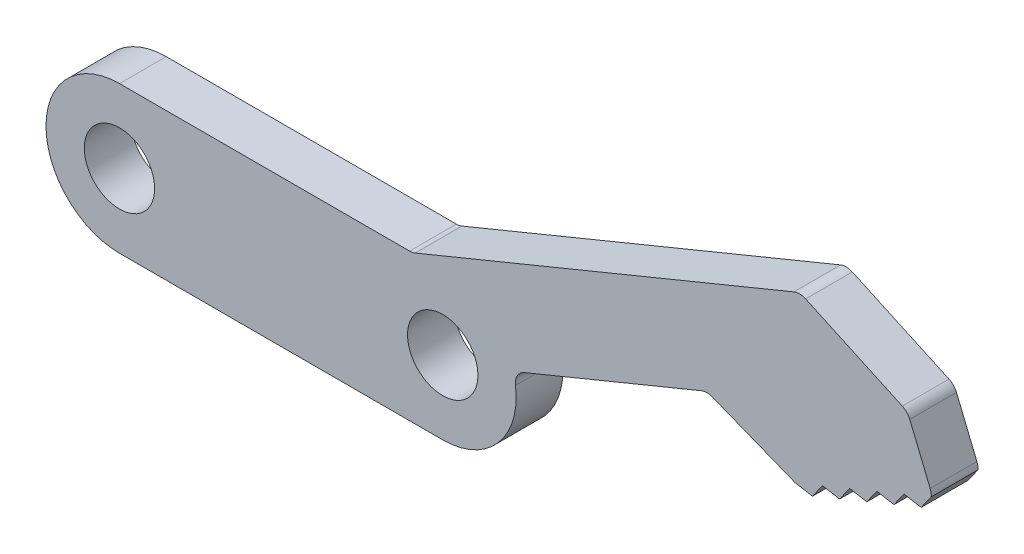
ISO-10303-21;
HEADER;
FILE_DESCRIPTION(('STEP AP214'),'2;1');
FILE_NAME('part.step','',(''),(''),'','','');
FILE_SCHEMA(('AUTOMOTIVE_DESIGN { 1 0 10303 214 1 1 1 1 }'));
ENDSEC;
DATA;
#1=APPLICATION_CONTEXT('core data for automotive mechanical design processes');
#2=APPLICATION_PROTOCOL_DEFINITION('international standard','automotive_design',2000,#1);
#3=PRODUCT_CONTEXT('',#1,'mechanical');
#4=PRODUCT('Part','Part','',(#3));
#5=PRODUCT_RELATED_PRODUCT_CATEGORY('part','',(#4));
#6=PRODUCT_DEFINITION_FORMATION('','',#4);
#7=PRODUCT_DEFINITION_CONTEXT('part definition',#1,'design');
#8=PRODUCT_DEFINITION('design','',#6,#7);
#9=PRODUCT_DEFINITION_SHAPE('','',#8);
#10=(LENGTH_UNIT() NAMED_UNIT(*) SI_UNIT(.MILLI.,.METRE.));
#11=(NAMED_UNIT(*) PLANE_ANGLE_UNIT() SI_UNIT($,.RADIAN.));
#12=(NAMED_UNIT(*) SI_UNIT($,.STERADIAN.) SOLID_ANGLE_UNIT());
#13=UNCERTAINTY_MEASURE_WITH_UNIT(LENGTH_MEASURE(1.E-05),#10,'distance_accuracy_value','');
#14=(GEOMETRIC_REPRESENTATION_CONTEXT(3) GLOBAL_UNCERTAINTY_ASSIGNED_CONTEXT((#13)) GLOBAL_UNIT_ASSIGNED_CONTEXT((#10,
#11,#12)) REPRESENTATION_CONTEXT('',''));
#15=CARTESIAN_POINT('',(0.,0.,0.));
#16=DIRECTION('',(0.,0.,1.));
#17=DIRECTION('',(1.,0.,0.));
#18=AXIS2_PLACEMENT_3D('',#15,#16,#17);
#19=CARTESIAN_POINT('',(22.,0.,3.18));
#20=DIRECTION('',(0.,0.,-1.));
#21=DIRECTION('',(-1.,0.,0.));
#22=AXIS2_PLACEMENT_3D('',#19,#20,#21);
#23=CYLINDRICAL_SURFACE('',#22,5.);
#24=CARTESIAN_POINT('',(22.,0.,0.));
#25=DIRECTION('',(0.,0.,1.));
#26=DIRECTION('',(1.,0.,0.));
#27=AXIS2_PLACEMENT_3D('',#24,#25,#26);
#28=CIRCLE('',#27,5.);
#29=CARTESIAN_POINT('',(22.,-5.,0.));
#30=VERTEX_POINT('',#29);
#31=CARTESIAN_POINT('',(26.9528767346151,0.68484454565145,0.));
#32=VERTEX_POINT('',#31);
#33=EDGE_CURVE('E303',#30,#32,#28,.T.);
#34=ORIENTED_EDGE('',*,*,#33,.T.);
#35=DIRECTION('',(0.,0.,-1.));
#36=VECTOR('',#35,1.);
#37=CARTESIAN_POINT('',(26.9528767346151,0.684844545651449,3.18));
#38=LINE('',#37,#36);
#39=CARTESIAN_POINT('',(26.9528767346151,0.68484454565145,3.18));
#40=VERTEX_POINT('',#39);
#41=EDGE_CURVE('E432',#32,#40,#38,.F.);
#42=ORIENTED_EDGE('',*,*,#41,.T.);
#43=CARTESIAN_POINT('',(22.,0.,3.18));
#44=DIRECTION('',(0.,0.,1.));
#45=DIRECTION('',(1.,0.,0.));
#46=AXIS2_PLACEMENT_3D('',#43,#44,#45);
#47=CIRCLE('',#46,5.);
#48=CARTESIAN_POINT('',(22.,-5.,3.18));
#49=VERTEX_POINT('',#48);
#50=EDGE_CURVE('E374',#49,#40,#47,.T.);
#51=ORIENTED_EDGE('',*,*,#50,.F.);
#52=DIRECTION('',(0.,0.,-1.));
#53=VECTOR('',#52,1.);
#54=CARTESIAN_POINT('',(22.,-5.,3.18));
#55=LINE('',#54,#53);
#56=EDGE_CURVE('E302',#49,#30,#55,.T.);
#57=ORIENTED_EDGE('',*,*,#56,.T.);
#58=EDGE_LOOP('',(#34,#42,#51,#57));
#59=FACE_BOUND('',#58,.T.);
#60=ADVANCED_FACE('F45',(#59),#23,.T.);
#61=CARTESIAN_POINT('',(3.37133749376371,-8.19978084499884,3.18));
#62=DIRECTION('',(-0.380263412733207,0.924878228166549,0.));
#63=DIRECTION('',(-0.924878228166549,-0.380263412733207,0.));
#64=AXIS2_PLACEMENT_3D('',#61,#62,#63);
#65=PLANE('',#64);
#66=DIRECTION('',(0.924878228166549,0.380263412733207,0.));
#67=VECTOR('',#66,1.);
#68=CARTESIAN_POINT('',(3.37133749376371,-8.19978084499884,0.));
#69=LINE('',#68,#67);
#70=CARTESIAN_POINT('',(27.5631886688049,1.74669168294829,0.));
#71=VERTEX_POINT('',#70);
#72=CARTESIAN_POINT('',(39.6051039173005,6.69772161184437,0.));
#73=VERTEX_POINT('',#72);
#74=EDGE_CURVE('E307',#71,#73,#69,.T.);
#75=ORIENTED_EDGE('',*,*,#74,.T.);
#76=DIRECTION('',(0.,0.,-1.));
#77=VECTOR('',#76,1.);
#78=CARTESIAN_POINT('',(39.6051039173005,6.69772161184437,3.18));
#79=LINE('',#78,#77);
#80=CARTESIAN_POINT('',(39.6051039173005,6.69772161184437,3.18));
#81=VERTEX_POINT('',#80);
#82=EDGE_CURVE('E429',#73,#81,#79,.F.);
#83=ORIENTED_EDGE('',*,*,#82,.T.);
#84=DIRECTION('',(0.924878228166549,0.380263412733207,0.));
#85=VECTOR('',#84,1.);
#86=CARTESIAN_POINT('',(3.37133749376371,-8.19978084499884,3.18));
#87=LINE('',#86,#85);
#88=CARTESIAN_POINT('',(27.5631886688049,1.74669168294829,3.18));
#89=VERTEX_POINT('',#88);
#90=EDGE_CURVE('E226',#89,#81,#87,.T.);
#91=ORIENTED_EDGE('',*,*,#90,.F.);
#92=DIRECTION('',(0.,0.,1.));
#93=VECTOR('',#92,1.);
#94=CARTESIAN_POINT('',(27.5631886688049,1.74669168294829,0.));
#95=LINE('',#94,#93);
#96=EDGE_CURVE('E425',#89,#71,#95,.F.);
#97=ORIENTED_EDGE('',*,*,#96,.T.);
#98=EDGE_LOOP('',(#75,#83,#91,#97));
#99=FACE_BOUND('',#98,.T.);
#100=ADVANCED_FACE('F597',(#99),#65,.F.);
#101=CARTESIAN_POINT('',(7.79104990716966,19.6278850306313,3.18));
#102=DIRECTION('',(0.368935795459582,0.929454882621317,0.));
#103=DIRECTION('',(-0.929454882621317,0.368935795459582,0.));
#104=AXIS2_PLACEMENT_3D('',#101,#102,#103);
#105=PLANE('',#104);
#106=DIRECTION('',(0.929454882621317,-0.368935795459582,0.));
#107=VECTOR('',#106,1.);
#108=CARTESIAN_POINT('',(7.79104990716966,19.6278850306313,3.18));
#109=LINE('',#108,#107);
#110=CARTESIAN_POINT('',(40.3543031254933,6.70229826629914,3.18));
#111=VERTEX_POINT('',#110);
#112=CARTESIAN_POINT('',(45.9997918227243,4.46139028656279,3.18));
#113=VERTEX_POINT('',#112);
#114=EDGE_CURVE('E211',#111,#113,#109,.T.);
#115=ORIENTED_EDGE('',*,*,#114,.F.);
#116=DIRECTION('',(0.,0.,-1.));
#117=VECTOR('',#116,1.);
#118=CARTESIAN_POINT('',(40.3543031254932,6.70229826629914,0.));
#119=LINE('',#118,#117);
#120=CARTESIAN_POINT('',(40.3543031254933,6.70229826629914,0.));
#121=VERTEX_POINT('',#120);
#122=EDGE_CURVE('E236',#111,#121,#119,.T.);
#123=ORIENTED_EDGE('',*,*,#122,.T.);
#124=DIRECTION('',(0.929454882621317,-0.368935795459582,0.));
#125=VECTOR('',#124,1.);
#126=CARTESIAN_POINT('',(7.79104990716966,19.6278850306313,0.));
#127=LINE('',#126,#125);
#128=CARTESIAN_POINT('',(45.9997918227243,4.46139028656279,0.));
#129=VERTEX_POINT('',#128);
#130=EDGE_CURVE('E232',#121,#129,#127,.T.);
#131=ORIENTED_EDGE('',*,*,#130,.T.);
#132=DIRECTION('',(0.,0.,-1.));
#133=VECTOR('',#132,1.);
#134=CARTESIAN_POINT('',(45.9997918227243,4.46139028656279,3.18));
#135=LINE('',#134,#133);
#136=EDGE_CURVE('E229',#113,#129,#135,.T.);
#137=ORIENTED_EDGE('',*,*,#136,.F.);
#138=EDGE_LOOP('',(#115,#123,#131,#137));
#139=FACE_BOUND('',#138,.T.);
#140=ADVANCED_FACE('F230',(#139),#105,.F.);
#141=CARTESIAN_POINT('',(2.10188818596754,12.0919570232387,3.18));
#142=DIRECTION('',(0.17125727503037,0.985226342395072,0.));
#143=DIRECTION('',(-0.985226342395072,0.17125727503037,0.));
#144=AXIS2_PLACEMENT_3D('',#141,#142,#143);
#145=PLANE('',#144);
#146=DIRECTION('',(0.985226342395072,-0.17125727503037,0.));
#147=VECTOR('',#146,1.);
#148=CARTESIAN_POINT('',(2.10188818596754,12.0919570232387,0.));
#149=LINE('',#148,#147);
#150=CARTESIAN_POINT('',(47.1642360009128,4.25898041555108,0.));
#151=VERTEX_POINT('',#150);
#152=EDGE_CURVE('E313',#129,#151,#149,.T.);
#153=ORIENTED_EDGE('',*,*,#152,.T.);
#154=DIRECTION('',(0.,0.,-1.));
#155=VECTOR('',#154,1.);
#156=CARTESIAN_POINT('',(47.1642360009128,4.25898041555108,3.18));
#157=LINE('',#156,#155);
#158=CARTESIAN_POINT('',(47.1642360009128,4.25898041555108,3.18));
#159=VERTEX_POINT('',#158);
#160=EDGE_CURVE('E237',#159,#151,#157,.T.);
#161=ORIENTED_EDGE('',*,*,#160,.F.);
#162=DIRECTION('',(0.985226342395072,-0.17125727503037,0.));
#163=VECTOR('',#162,1.);
#164=CARTESIAN_POINT('',(2.10188818596754,12.0919570232387,3.18));
#165=LINE('',#164,#163);
#166=EDGE_CURVE('E217',#113,#159,#165,.T.);
#167=ORIENTED_EDGE('',*,*,#166,.F.);
#168=ORIENTED_EDGE('',*,*,#136,.T.);
#169=EDGE_LOOP('',(#153,#161,#167,#168));
#170=FACE_BOUND('',#169,.T.);
#171=ADVANCED_FACE('F239',(#170),#145,.F.);
#172=CARTESIAN_POINT('',(29.2951152139847,-20.8490363065743,3.18));
#173=DIRECTION('',(-0.814732571298571,0.579836905746106,0.));
#174=DIRECTION('',(-0.579836905746106,-0.814732571298571,0.));
#175=AXIS2_PLACEMENT_3D('',#172,#173,#174);
#176=PLANE('',#175);
#177=DIRECTION('',(0.579836905746106,0.814732571298571,0.));
#178=VECTOR('',#177,1.);
#179=CARTESIAN_POINT('',(29.2951152139847,-20.8490363065743,0.));
#180=LINE('',#179,#178);
#181=CARTESIAN_POINT('',(47.8495482790574,5.22191711202921,0.));
#182=VERTEX_POINT('',#181);
#183=EDGE_CURVE('E316',#151,#182,#180,.T.);
#184=ORIENTED_EDGE('',*,*,#183,.T.);
#185=DIRECTION('',(0.,0.,-1.));
#186=VECTOR('',#185,1.);
#187=CARTESIAN_POINT('',(47.8495482790574,5.22191711202921,3.18));
#188=LINE('',#187,#186);
#189=CARTESIAN_POINT('',(47.8495482790574,5.22191711202921,3.18));
#190=VERTEX_POINT('',#189);
#191=EDGE_CURVE('E417',#190,#182,#188,.T.);
#192=ORIENTED_EDGE('',*,*,#191,.F.);
#193=DIRECTION('',(0.579836905746106,0.814732571298571,0.));
#194=VECTOR('',#193,1.);
#195=CARTESIAN_POINT('',(29.2951152139847,-20.8490363065743,3.18));
#196=LINE('',#195,#194);
#197=EDGE_CURVE('E243',#159,#190,#196,.T.);
#198=ORIENTED_EDGE('',*,*,#197,.F.);
#199=ORIENTED_EDGE('',*,*,#160,.T.);
#200=EDGE_LOOP('',(#184,#192,#198,#199));
#201=FACE_BOUND('',#200,.T.);
#202=ADVANCED_FACE('F533',(#201),#176,.F.);
#203=CARTESIAN_POINT('',(2.28446133900246,13.142282504316,3.18));
#204=DIRECTION('',(0.17125727503036,0.985226342395074,0.));
#205=DIRECTION('',(-0.985226342395074,0.17125727503036,0.));
#206=AXIS2_PLACEMENT_3D('',#203,#204,#205);
#207=PLANE('',#206);
#208=DIRECTION('',(0.985226342395074,-0.17125727503036,0.));
#209=VECTOR('',#208,1.);
#210=CARTESIAN_POINT('',(2.28446133900246,13.142282504316,0.));
#211=LINE('',#210,#209);
#212=CARTESIAN_POINT('',(49.0139924572459,5.01950724101749,0.));
#213=VERTEX_POINT('',#212);
#214=EDGE_CURVE('E319',#182,#213,#211,.T.);
#215=ORIENTED_EDGE('',*,*,#214,.T.);
#216=DIRECTION('',(0.,0.,-1.));
#217=VECTOR('',#216,1.);
#218=CARTESIAN_POINT('',(49.0139924572459,5.01950724101749,3.18));
#219=LINE('',#218,#217);
#220=CARTESIAN_POINT('',(49.0139924572459,5.01950724101749,3.18));
#221=VERTEX_POINT('',#220);
#222=EDGE_CURVE('E413',#221,#213,#219,.T.);
#223=ORIENTED_EDGE('',*,*,#222,.F.);
#224=DIRECTION('',(0.985226342395074,-0.17125727503036,0.));
#225=VECTOR('',#224,1.);
#226=CARTESIAN_POINT('',(2.28446133900246,13.142282504316,3.18));
#227=LINE('',#226,#225);
#228=EDGE_CURVE('E246',#190,#221,#227,.T.);
#229=ORIENTED_EDGE('',*,*,#228,.F.);
#230=ORIENTED_EDGE('',*,*,#191,.T.);
#231=EDGE_LOOP('',(#215,#223,#229,#230));
#232=FACE_BOUND('',#231,.T.);
#233=ADVANCED_FACE('F540',(#232),#207,.F.);
#234=CARTESIAN_POINT('',(30.1636814947223,-21.4671861171995,3.18));
#235=DIRECTION('',(-0.81473257129857,0.579836905746107,0.));
#236=DIRECTION('',(-0.579836905746107,-0.81473257129857,0.));
#237=AXIS2_PLACEMENT_3D('',#234,#235,#236);
#238=PLANE('',#237);
#239=DIRECTION('',(0.579836905746107,0.81473257129857,0.));
#240=VECTOR('',#239,1.);
#241=CARTESIAN_POINT('',(30.1636814947223,-21.4671861171995,0.));
#242=LINE('',#241,#240);
#243=CARTESIAN_POINT('',(49.6993047353905,5.98244393749563,0.));
#244=VERTEX_POINT('',#243);
#245=EDGE_CURVE('E322',#213,#244,#242,.T.);
#246=ORIENTED_EDGE('',*,*,#245,.T.);
#247=DIRECTION('',(0.,0.,-1.));
#248=VECTOR('',#247,1.);
#249=CARTESIAN_POINT('',(49.6993047353905,5.98244393749563,3.18));
#250=LINE('',#249,#248);
#251=CARTESIAN_POINT('',(49.6993047353905,5.98244393749563,3.18));
#252=VERTEX_POINT('',#251);
#253=EDGE_CURVE('E409',#252,#244,#250,.T.);
#254=ORIENTED_EDGE('',*,*,#253,.F.);
#255=DIRECTION('',(0.579836905746107,0.81473257129857,0.));
#256=VECTOR('',#255,1.);
#257=CARTESIAN_POINT('',(30.1636814947223,-21.4671861171995,3.18));
#258=LINE('',#257,#256);
#259=EDGE_CURVE('E252',#221,#252,#258,.T.);
#260=ORIENTED_EDGE('',*,*,#259,.F.);
#261=ORIENTED_EDGE('',*,*,#222,.T.);
#262=EDGE_LOOP('',(#246,#254,#260,#261));
#263=FACE_BOUND('',#262,.T.);
#264=ADVANCED_FACE('F543',(#263),#238,.F.);
#265=CARTESIAN_POINT('',(2.46703449203757,14.1926079853937,3.18));
#266=DIRECTION('',(0.17125727503036,0.985226342395074,0.));
#267=DIRECTION('',(-0.985226342395074,0.17125727503036,0.));
#268=AXIS2_PLACEMENT_3D('',#265,#266,#267);
#269=PLANE('',#268);
#270=DIRECTION('',(0.985226342395074,-0.17125727503036,0.));
#271=VECTOR('',#270,1.);
#272=CARTESIAN_POINT('',(2.46703449203757,14.1926079853937,0.));
#273=LINE('',#272,#271);
#274=CARTESIAN_POINT('',(50.863748913579,5.78003406648391,0.));
#275=VERTEX_POINT('',#274);
#276=EDGE_CURVE('E325',#244,#275,#273,.T.);
#277=ORIENTED_EDGE('',*,*,#276,.T.);
#278=DIRECTION('',(0.,0.,-1.));
#279=VECTOR('',#278,1.);
#280=CARTESIAN_POINT('',(50.863748913579,5.78003406648391,3.18));
#281=LINE('',#280,#279);
#282=CARTESIAN_POINT('',(50.863748913579,5.78003406648391,3.18));
#283=VERTEX_POINT('',#282);
#284=EDGE_CURVE('E405',#283,#275,#281,.T.);
#285=ORIENTED_EDGE('',*,*,#284,.F.);
#286=DIRECTION('',(0.985226342395074,-0.17125727503036,0.));
#287=VECTOR('',#286,1.);
#288=CARTESIAN_POINT('',(2.46703449203757,14.1926079853937,3.18));
#289=LINE('',#288,#287);
#290=EDGE_CURVE('E255',#252,#283,#289,.T.);
#291=ORIENTED_EDGE('',*,*,#290,.F.);
#292=ORIENTED_EDGE('',*,*,#253,.T.);
#293=EDGE_LOOP('',(#277,#285,#291,#292));
#294=FACE_BOUND('',#293,.T.);
#295=ADVANCED_FACE('F548',(#294),#269,.F.);
#296=CARTESIAN_POINT('',(31.0322477754599,-22.0853359278246,3.18));
#297=DIRECTION('',(-0.81473257129857,0.579836905746107,0.));
#298=DIRECTION('',(-0.579836905746107,-0.81473257129857,0.));
#299=AXIS2_PLACEMENT_3D('',#296,#297,#298);
#300=PLANE('',#299);
#301=DIRECTION('',(0.579836905746107,0.81473257129857,0.));
#302=VECTOR('',#301,1.);
#303=CARTESIAN_POINT('',(31.0322477754599,-22.0853359278246,0.));
#304=LINE('',#303,#302);
#305=CARTESIAN_POINT('',(51.5490611917236,6.74297076296204,0.));
#306=VERTEX_POINT('',#305);
#307=EDGE_CURVE('E328',#275,#306,#304,.T.);
#308=ORIENTED_EDGE('',*,*,#307,.T.);
#309=DIRECTION('',(0.,0.,-1.));
#310=VECTOR('',#309,1.);
#311=CARTESIAN_POINT('',(51.5490611917236,6.74297076296204,3.18));
#312=LINE('',#311,#310);
#313=CARTESIAN_POINT('',(51.5490611917236,6.74297076296204,3.18));
#314=VERTEX_POINT('',#313);
#315=EDGE_CURVE('E401',#314,#306,#312,.T.);
#316=ORIENTED_EDGE('',*,*,#315,.F.);
#317=DIRECTION('',(0.579836905746107,0.81473257129857,0.));
#318=VECTOR('',#317,1.);
#319=CARTESIAN_POINT('',(31.0322477754599,-22.0853359278246,3.18));
#320=LINE('',#319,#318);
#321=EDGE_CURVE('E258',#283,#314,#320,.T.);
#322=ORIENTED_EDGE('',*,*,#321,.F.);
#323=ORIENTED_EDGE('',*,*,#284,.T.);
#324=EDGE_LOOP('',(#308,#316,#322,#323));
#325=FACE_BOUND('',#324,.T.);
#326=ADVANCED_FACE('F554',(#325),#300,.F.);
#327=CARTESIAN_POINT('',(2.64960764507268,15.2429334664715,3.18));
#328=DIRECTION('',(0.17125727503036,0.985226342395074,0.));
#329=DIRECTION('',(-0.985226342395074,0.17125727503036,0.));
#330=AXIS2_PLACEMENT_3D('',#327,#328,#329);
#331=PLANE('',#330);
#332=DIRECTION('',(0.985226342395074,-0.17125727503036,0.));
#333=VECTOR('',#332,1.);
#334=CARTESIAN_POINT('',(2.64960764507268,15.2429334664715,0.));
#335=LINE('',#334,#333);
#336=CARTESIAN_POINT('',(52.7135053699121,6.54056089195032,0.));
#337=VERTEX_POINT('',#336);
#338=EDGE_CURVE('E331',#306,#337,#335,.T.);
#339=ORIENTED_EDGE('',*,*,#338,.T.);
#340=DIRECTION('',(0.,0.,-1.));
#341=VECTOR('',#340,1.);
#342=CARTESIAN_POINT('',(52.7135053699121,6.54056089195032,3.18));
#343=LINE('',#342,#341);
#344=CARTESIAN_POINT('',(52.7135053699121,6.54056089195032,3.18));
#345=VERTEX_POINT('',#344);
#346=EDGE_CURVE('E397',#345,#337,#343,.T.);
#347=ORIENTED_EDGE('',*,*,#346,.F.);
#348=DIRECTION('',(0.985226342395074,-0.17125727503036,0.));
#349=VECTOR('',#348,1.);
#350=CARTESIAN_POINT('',(2.64960764507268,15.2429334664715,3.18));
#351=LINE('',#350,#349);
#352=EDGE_CURVE('E261',#314,#345,#351,.T.);
#353=ORIENTED_EDGE('',*,*,#352,.F.);
#354=ORIENTED_EDGE('',*,*,#315,.T.);
#355=EDGE_LOOP('',(#339,#347,#353,#354));
#356=FACE_BOUND('',#355,.T.);
#357=ADVANCED_FACE('F558',(#356),#331,.F.);
#358=CARTESIAN_POINT('',(31.9008140561977,-22.7034857384497,3.18));
#359=DIRECTION('',(-0.814732571298571,0.579836905746106,0.));
#360=DIRECTION('',(-0.579836905746106,-0.814732571298571,0.));
#361=AXIS2_PLACEMENT_3D('',#358,#359,#360);
#362=PLANE('',#361);
#363=DIRECTION('',(0.579836905746106,0.814732571298571,0.));
#364=VECTOR('',#363,1.);
#365=CARTESIAN_POINT('',(31.9008140561977,-22.7034857384497,0.));
#366=LINE('',#365,#364);
#367=CARTESIAN_POINT('',(53.3988176480567,7.50349758842846,0.));
#368=VERTEX_POINT('',#367);
#369=EDGE_CURVE('E334',#337,#368,#366,.T.);
#370=ORIENTED_EDGE('',*,*,#369,.T.);
#371=DIRECTION('',(0.,0.,-1.));
#372=VECTOR('',#371,1.);
#373=CARTESIAN_POINT('',(53.3988176480567,7.50349758842846,3.18));
#374=LINE('',#373,#372);
#375=CARTESIAN_POINT('',(53.3988176480567,7.50349758842846,3.18));
#376=VERTEX_POINT('',#375);
#377=EDGE_CURVE('E393',#376,#368,#374,.T.);
#378=ORIENTED_EDGE('',*,*,#377,.F.);
#379=DIRECTION('',(0.579836905746106,0.814732571298571,0.));
#380=VECTOR('',#379,1.);
#381=CARTESIAN_POINT('',(31.9008140561977,-22.7034857384497,3.18));
#382=LINE('',#381,#380);
#383=EDGE_CURVE('E264',#345,#376,#382,.T.);
#384=ORIENTED_EDGE('',*,*,#383,.F.);
#385=ORIENTED_EDGE('',*,*,#346,.T.);
#386=EDGE_LOOP('',(#370,#378,#384,#385));
#387=FACE_BOUND('',#386,.T.);
#388=ADVANCED_FACE('F563',(#387),#362,.F.);
#389=CARTESIAN_POINT('',(2.83218079810797,16.2932589475495,3.18));
#390=DIRECTION('',(0.171257275030367,0.985226342395073,0.));
#391=DIRECTION('',(-0.985226342395073,0.171257275030367,0.));
#392=AXIS2_PLACEMENT_3D('',#389,#390,#391);
#393=PLANE('',#392);
#394=DIRECTION('',(0.985226342395073,-0.171257275030367,0.));
#395=VECTOR('',#394,1.);
#396=CARTESIAN_POINT('',(2.83218079810797,16.2932589475495,0.));
#397=LINE('',#396,#395);
#398=CARTESIAN_POINT('',(54.5632618262452,7.30108771741674,0.));
#399=VERTEX_POINT('',#398);
#400=EDGE_CURVE('E337',#368,#399,#397,.T.);
#401=ORIENTED_EDGE('',*,*,#400,.T.);
#402=DIRECTION('',(0.,0.,-1.));
#403=VECTOR('',#402,1.);
#404=CARTESIAN_POINT('',(54.5632618262452,7.30108771741674,3.18));
#405=LINE('',#404,#403);
#406=CARTESIAN_POINT('',(54.5632618262452,7.30108771741674,3.18));
#407=VERTEX_POINT('',#406);
#408=EDGE_CURVE('E389',#407,#399,#405,.T.);
#409=ORIENTED_EDGE('',*,*,#408,.F.);
#410=DIRECTION('',(0.985226342395073,-0.171257275030367,0.));
#411=VECTOR('',#410,1.);
#412=CARTESIAN_POINT('',(2.83218079810797,16.2932589475495,3.18));
#413=LINE('',#412,#411);
#414=EDGE_CURVE('E267',#376,#407,#413,.T.);
#415=ORIENTED_EDGE('',*,*,#414,.F.);
#416=ORIENTED_EDGE('',*,*,#377,.T.);
#417=EDGE_LOOP('',(#401,#409,#415,#416));
#418=FACE_BOUND('',#417,.T.);
#419=ADVANCED_FACE('F569',(#418),#393,.F.);
#420=CARTESIAN_POINT('',(32.7693803369352,-23.3216355490748,3.18));
#421=DIRECTION('',(-0.81473257129857,0.579836905746108,0.));
#422=DIRECTION('',(-0.579836905746108,-0.81473257129857,0.));
#423=AXIS2_PLACEMENT_3D('',#420,#421,#422);
#424=PLANE('',#423);
#425=DIRECTION('',(0.579836905746108,0.81473257129857,0.));
#426=VECTOR('',#425,1.);
#427=CARTESIAN_POINT('',(32.7693803369352,-23.3216355490748,0.));
#428=LINE('',#427,#426);
#429=CARTESIAN_POINT('',(55.2485741043898,8.26402441389487,0.));
#430=VERTEX_POINT('',#429);
#431=EDGE_CURVE('E340',#399,#430,#428,.T.);
#432=ORIENTED_EDGE('',*,*,#431,.T.);
#433=DIRECTION('',(0.,0.,-1.));
#434=VECTOR('',#433,1.);
#435=CARTESIAN_POINT('',(55.2485741043898,8.26402441389487,3.18));
#436=LINE('',#435,#434);
#437=CARTESIAN_POINT('',(55.2485741043898,8.26402441389487,3.18));
#438=VERTEX_POINT('',#437);
#439=EDGE_CURVE('E385',#438,#430,#436,.T.);
#440=ORIENTED_EDGE('',*,*,#439,.F.);
#441=DIRECTION('',(0.579836905746108,0.81473257129857,0.));
#442=VECTOR('',#441,1.);
#443=CARTESIAN_POINT('',(32.7693803369352,-23.3216355490748,3.18));
#444=LINE('',#443,#442);
#445=EDGE_CURVE('E270',#407,#438,#444,.T.);
#446=ORIENTED_EDGE('',*,*,#445,.F.);
#447=ORIENTED_EDGE('',*,*,#408,.T.);
#448=EDGE_LOOP('',(#432,#440,#446,#447));
#449=FACE_BOUND('',#448,.T.);
#450=ADVANCED_FACE('F573',(#449),#424,.F.);
#451=CARTESIAN_POINT('',(50.2646539702656,20.6662977638446,3.18));
#452=DIRECTION('',(0.924878228166549,0.380263412733206,0.));
#453=DIRECTION('',(-0.380263412733206,0.924878228166549,0.));
#454=AXIS2_PLACEMENT_3D('',#451,#452,#453);
#455=PLANE('',#454);
#456=DIRECTION('',(0.380263412733206,-0.924878228166549,0.));
#457=VECTOR('',#456,1.);
#458=CARTESIAN_POINT('',(50.2646539702656,20.6662977638446,0.));
#459=LINE('',#458,#457);
#460=CARTESIAN_POINT('',(53.7856310884989,12.1025628120117,0.));
#461=VERTEX_POINT('',#460);
#462=CARTESIAN_POINT('',(55.1763301332818,8.72009890572444,0.));
#463=VERTEX_POINT('',#462);
#464=EDGE_CURVE('E344',#461,#463,#459,.T.);
#465=ORIENTED_EDGE('',*,*,#464,.F.);
#466=DIRECTION('',(0.,0.,-1.));
#467=VECTOR('',#466,1.);
#468=CARTESIAN_POINT('',(53.7856310884989,12.1025628120117,3.18));
#469=LINE('',#468,#467);
#470=CARTESIAN_POINT('',(53.7856310884989,12.1025628120117,3.18));
#471=VERTEX_POINT('',#470);
#472=EDGE_CURVE('E68',#461,#471,#469,.F.);
#473=ORIENTED_EDGE('',*,*,#472,.T.);
#474=DIRECTION('',(0.380263412733206,-0.924878228166549,0.));
#475=VECTOR('',#474,1.);
#476=CARTESIAN_POINT('',(50.2646539702656,20.6662977638446,3.18));
#477=LINE('',#476,#475);
#478=CARTESIAN_POINT('',(55.1763301332818,8.72009890572444,3.18));
#479=VERTEX_POINT('',#478);
#480=EDGE_CURVE('E273',#471,#479,#477,.T.);
#481=ORIENTED_EDGE('',*,*,#480,.T.);
#482=DIRECTION('',(0.,0.,1.));
#483=VECTOR('',#482,1.);
#484=CARTESIAN_POINT('',(55.1763301332818,8.72009890572444,0.));
#485=LINE('',#484,#483);
#486=EDGE_CURVE('E470',#479,#463,#485,.F.);
#487=ORIENTED_EDGE('',*,*,#486,.T.);
#488=EDGE_LOOP('',(#465,#473,#481,#487));
#489=FACE_BOUND('',#488,.T.);
#490=ADVANCED_FACE('F576',(#489),#455,.T.);
#491=CARTESIAN_POINT('',(14.0890364892354,30.6470251229262,3.18));
#492=DIRECTION('',(0.417695282980301,0.90858717279962,0.));
#493=DIRECTION('',(-0.90858717279962,0.417695282980301,0.));
#494=AXIS2_PLACEMENT_3D('',#491,#492,#493);
#495=PLANE('',#494);
#496=DIRECTION('',(0.90858717279962,-0.417695282980301,0.));
#497=VECTOR('',#496,1.);
#498=CARTESIAN_POINT('',(14.0890364892354,30.6470251229262,0.));
#499=LINE('',#498,#497);
#500=CARTESIAN_POINT('',(46.6987152273009,15.6557184039209,0.));
#501=VERTEX_POINT('',#500);
#502=CARTESIAN_POINT('',(53.2784481433127,12.6308865720781,0.));
#503=VERTEX_POINT('',#502);
#504=EDGE_CURVE('E348',#501,#503,#499,.T.);
#505=ORIENTED_EDGE('',*,*,#504,.F.);
#506=DIRECTION('',(0.,0.,-1.));
#507=VECTOR('',#506,1.);
#508=CARTESIAN_POINT('',(46.6987152273009,15.6557184039209,3.18));
#509=LINE('',#508,#507);
#510=CARTESIAN_POINT('',(46.6987152273009,15.6557184039209,3.18));
#511=VERTEX_POINT('',#510);
#512=EDGE_CURVE('E459',#501,#511,#509,.F.);
#513=ORIENTED_EDGE('',*,*,#512,.T.);
#514=DIRECTION('',(0.90858717279962,-0.417695282980301,0.));
#515=VECTOR('',#514,1.);
#516=CARTESIAN_POINT('',(14.0890364892354,30.6470251229262,3.18));
#517=LINE('',#516,#515);
#518=CARTESIAN_POINT('',(53.2784481433127,12.6308865720781,3.18));
#519=VERTEX_POINT('',#518);
#520=EDGE_CURVE('E276',#511,#519,#517,.T.);
#521=ORIENTED_EDGE('',*,*,#520,.T.);
#522=DIRECTION('',(0.,0.,-1.));
#523=VECTOR('',#522,1.);
#524=CARTESIAN_POINT('',(53.2784481433127,12.6308865720781,3.18));
#525=LINE('',#524,#523);
#526=EDGE_CURVE('E455',#519,#503,#525,.T.);
#527=ORIENTED_EDGE('',*,*,#526,.T.);
#528=EDGE_LOOP('',(#505,#513,#521,#527));
#529=FACE_BOUND('',#528,.T.);
#530=ADVANCED_FACE('F583',(#529),#495,.T.);
#531=CARTESIAN_POINT('',(1.12545725125181,-2.73734173091556,3.18));
#532=DIRECTION('',(-0.380263412733206,0.924878228166549,0.));
#533=DIRECTION('',(-0.924878228166549,-0.380263412733206,0.));
#534=AXIS2_PLACEMENT_3D('',#531,#532,#533);
#535=PLANE('',#534);
#536=DIRECTION('',(0.924878228166549,0.380263412733206,0.));
#537=VECTOR('',#536,1.);
#538=CARTESIAN_POINT('',(1.12545725125181,-2.73734173091556,0.));
#539=LINE('',#538,#537);
#540=CARTESIAN_POINT('',(20.1269629446429,5.07512177183345,0.));
#541=VERTEX_POINT('',#540);
#542=CARTESIAN_POINT('',(45.9007565315874,15.6720094592878,0.));
#543=VERTEX_POINT('',#542);
#544=EDGE_CURVE('E352',#541,#543,#539,.T.);
#545=ORIENTED_EDGE('',*,*,#544,.F.);
#546=DIRECTION('',(0.,0.,-1.));
#547=VECTOR('',#546,1.);
#548=CARTESIAN_POINT('',(20.1269629446429,5.07512177183345,3.18));
#549=LINE('',#548,#547);
#550=CARTESIAN_POINT('',(20.1269629446429,5.07512177183345,3.18));
#551=VERTEX_POINT('',#550);
#552=EDGE_CURVE('E443',#541,#551,#549,.F.);
#553=ORIENTED_EDGE('',*,*,#552,.T.);
#554=DIRECTION('',(0.924878228166549,0.380263412733206,0.));
#555=VECTOR('',#554,1.);
#556=CARTESIAN_POINT('',(1.12545725125181,-2.73734173091556,3.18));
#557=LINE('',#556,#555);
#558=CARTESIAN_POINT('',(45.9007565315874,15.6720094592878,3.18));
#559=VERTEX_POINT('',#558);
#560=EDGE_CURVE('E280',#551,#559,#557,.T.);
#561=ORIENTED_EDGE('',*,*,#560,.T.);
#562=DIRECTION('',(0.,0.,-1.));
#563=VECTOR('',#562,1.);
#564=CARTESIAN_POINT('',(45.9007565315874,15.6720094592878,3.18));
#565=LINE('',#564,#563);
#566=EDGE_CURVE('E439',#559,#543,#565,.T.);
#567=ORIENTED_EDGE('',*,*,#566,.T.);
#568=EDGE_LOOP('',(#545,#553,#561,#567));
#569=FACE_BOUND('',#568,.T.);
#570=ADVANCED_FACE('F497',(#569),#535,.T.);
#571=CARTESIAN_POINT('',(0.,5.,3.18));
#572=DIRECTION('',(0.,1.,0.));
#573=DIRECTION('',(0.,0.,1.));
#574=AXIS2_PLACEMENT_3D('',#571,#572,#573);
#575=PLANE('',#574);
#576=DIRECTION('',(1.,0.,0.));
#577=VECTOR('',#576,1.);
#578=CARTESIAN_POINT('',(0.,5.,3.18));
#579=LINE('',#578,#577);
#580=CARTESIAN_POINT('',(0.,5.,3.18));
#581=VERTEX_POINT('',#580);
#582=CARTESIAN_POINT('',(19.7466995319097,5.,3.18));
#583=VERTEX_POINT('',#582);
#584=EDGE_CURVE('E284',#581,#583,#579,.T.);
#585=ORIENTED_EDGE('',*,*,#584,.T.);
#586=DIRECTION('',(0.,0.,-1.));
#587=VECTOR('',#586,1.);
#588=CARTESIAN_POINT('',(19.7466995319097,5.,0.));
#589=LINE('',#588,#587);
#590=CARTESIAN_POINT('',(19.7466995319097,5.,0.));
#591=VERTEX_POINT('',#590);
#592=EDGE_CURVE('E435',#583,#591,#589,.T.);
#593=ORIENTED_EDGE('',*,*,#592,.T.);
#594=DIRECTION('',(1.,0.,0.));
#595=VECTOR('',#594,1.);
#596=CARTESIAN_POINT('',(0.,5.,0.));
#597=LINE('',#596,#595);
#598=CARTESIAN_POINT('',(0.,5.,0.));
#599=VERTEX_POINT('',#598);
#600=EDGE_CURVE('E356',#599,#591,#597,.T.);
#601=ORIENTED_EDGE('',*,*,#600,.F.);
#602=DIRECTION('',(0.,0.,-1.));
#603=VECTOR('',#602,1.);
#604=CARTESIAN_POINT('',(0.,5.,3.18));
#605=LINE('',#604,#603);
#606=EDGE_CURVE('E382',#581,#599,#605,.T.);
#607=ORIENTED_EDGE('',*,*,#606,.F.);
#608=EDGE_LOOP('',(#585,#593,#601,#607));
#609=FACE_BOUND('',#608,.T.);
#610=ADVANCED_FACE('F504',(#609),#575,.T.);
#611=CARTESIAN_POINT('',(0.,0.,3.18));
#612=DIRECTION('',(0.,0.,-1.));
#613=DIRECTION('',(-1.,0.,0.));
#614=AXIS2_PLACEMENT_3D('',#611,#612,#613);
#615=CYLINDRICAL_SURFACE('',#614,5.);
#616=CARTESIAN_POINT('',(0.,0.,0.));
#617=DIRECTION('',(0.,0.,1.));
#618=DIRECTION('',(1.,0.,0.));
#619=AXIS2_PLACEMENT_3D('',#616,#617,#618);
#620=CIRCLE('',#619,5.);
#621=CARTESIAN_POINT('',(0.,-5.,0.));
#622=VERTEX_POINT('',#621);
#623=EDGE_CURVE('E360',#599,#622,#620,.T.);
#624=ORIENTED_EDGE('',*,*,#623,.T.);
#625=DIRECTION('',(0.,0.,-1.));
#626=VECTOR('',#625,1.);
#627=CARTESIAN_POINT('',(0.,-5.,3.18));
#628=LINE('',#627,#626);
#629=CARTESIAN_POINT('',(0.,-5.,3.18));
#630=VERTEX_POINT('',#629);
#631=EDGE_CURVE('E378',#630,#622,#628,.T.);
#632=ORIENTED_EDGE('',*,*,#631,.F.);
#633=CARTESIAN_POINT('',(0.,0.,3.18));
#634=DIRECTION('',(0.,0.,1.));
#635=DIRECTION('',(1.,0.,0.));
#636=AXIS2_PLACEMENT_3D('',#633,#634,#635);
#637=CIRCLE('',#636,5.);
#638=EDGE_CURVE('E288',#581,#630,#637,.T.);
#639=ORIENTED_EDGE('',*,*,#638,.F.);
#640=ORIENTED_EDGE('',*,*,#606,.T.);
#641=EDGE_LOOP('',(#624,#632,#639,#640));
#642=FACE_BOUND('',#641,.T.);
#643=ADVANCED_FACE('F508',(#642),#615,.T.);
#644=CARTESIAN_POINT('',(22.,0.,3.18));
#645=DIRECTION('',(0.,0.,-1.));
#646=DIRECTION('',(-1.,0.,0.));
#647=AXIS2_PLACEMENT_3D('',#644,#645,#646);
#648=CYLINDRICAL_SURFACE('',#647,2.395);
#649=CARTESIAN_POINT('',(22.,0.,3.18));
#650=DIRECTION('',(0.,0.,1.));
#651=DIRECTION('',(1.,0.,0.));
#652=AXIS2_PLACEMENT_3D('',#649,#650,#651);
#653=CIRCLE('',#652,2.395);
#654=CARTESIAN_POINT('',(19.605,0.,3.18));
#655=VERTEX_POINT('',#654);
#656=EDGE_CURVE('E294',#655,#655,#653,.T.);
#657=CARTESIAN_POINT('',(22.,0.,0.));
#658=DIRECTION('',(0.,0.,1.));
#659=DIRECTION('',(1.,0.,0.));
#660=AXIS2_PLACEMENT_3D('',#657,#658,#659);
#661=CIRCLE('',#660,2.395);
#662=CARTESIAN_POINT('',(19.605,0.,0.));
#663=VERTEX_POINT('',#662);
#664=EDGE_CURVE('E366',#663,#663,#661,.T.);
#665=CARTESIAN_POINT('',(19.605,0.,3.18));
#666=CARTESIAN_POINT('',(19.605,0.,3.146875));
#667=CARTESIAN_POINT('',(19.605,0.,3.11375));
#668=CARTESIAN_POINT('',(19.605,0.,3.0475));
#669=CARTESIAN_POINT('',(19.605,0.,3.014375));
#670=CARTESIAN_POINT('',(19.605,0.,2.948125));
#671=CARTESIAN_POINT('',(19.605,0.,2.915));
#672=CARTESIAN_POINT('',(19.605,0.,2.84875));
#673=CARTESIAN_POINT('',(19.605,0.,2.815625));
#674=CARTESIAN_POINT('',(19.605,0.,2.749375));
#675=CARTESIAN_POINT('',(19.605,0.,2.71625));
#676=CARTESIAN_POINT('',(19.605,0.,2.65));
#677=CARTESIAN_POINT('',(19.605,0.,2.616875));
#678=CARTESIAN_POINT('',(19.605,0.,2.550625));
#679=CARTESIAN_POINT('',(19.605,0.,2.5175));
#680=CARTESIAN_POINT('',(19.605,0.,2.45125));
#681=CARTESIAN_POINT('',(19.605,0.,2.418125));
#682=CARTESIAN_POINT('',(19.605,0.,2.351875));
#683=CARTESIAN_POINT('',(19.605,0.,2.31875));
#684=CARTESIAN_POINT('',(19.605,0.,2.2525));
#685=CARTESIAN_POINT('',(19.605,0.,2.219375));
#686=CARTESIAN_POINT('',(19.605,0.,2.153125));
#687=CARTESIAN_POINT('',(19.605,0.,2.12));
#688=CARTESIAN_POINT('',(19.605,0.,2.05375));
#689=CARTESIAN_POINT('',(19.605,0.,2.020625));
#690=CARTESIAN_POINT('',(19.605,0.,1.954375));
#691=CARTESIAN_POINT('',(19.605,0.,1.92125));
#692=CARTESIAN_POINT('',(19.605,0.,1.855));
#693=CARTESIAN_POINT('',(19.605,0.,1.821875));
#694=CARTESIAN_POINT('',(19.605,0.,1.755625));
#695=CARTESIAN_POINT('',(19.605,0.,1.7225));
#696=CARTESIAN_POINT('',(19.605,0.,1.65625));
#697=CARTESIAN_POINT('',(19.605,0.,1.623125));
#698=CARTESIAN_POINT('',(19.605,0.,1.556875));
#699=CARTESIAN_POINT('',(19.605,0.,1.52375));
#700=CARTESIAN_POINT('',(19.605,0.,1.4575));
#701=CARTESIAN_POINT('',(19.605,0.,1.424375));
#702=CARTESIAN_POINT('',(19.605,0.,1.358125));
#703=CARTESIAN_POINT('',(19.605,0.,1.325));
#704=CARTESIAN_POINT('',(19.605,0.,1.25875));
#705=CARTESIAN_POINT('',(19.605,0.,1.225625));
#706=CARTESIAN_POINT('',(19.605,0.,1.159375));
#707=CARTESIAN_POINT('',(19.605,0.,1.12625));
#708=CARTESIAN_POINT('',(19.605,0.,1.06));
#709=CARTESIAN_POINT('',(19.605,0.,1.026875));
#710=CARTESIAN_POINT('',(19.605,0.,0.960625));
#711=CARTESIAN_POINT('',(19.605,0.,0.9275));
#712=CARTESIAN_POINT('',(19.605,0.,0.86125));
#713=CARTESIAN_POINT('',(19.605,0.,0.828125));
#714=CARTESIAN_POINT('',(19.605,0.,0.761875));
#715=CARTESIAN_POINT('',(19.605,0.,0.72875));
#716=CARTESIAN_POINT('',(19.605,0.,0.6625));
#717=CARTESIAN_POINT('',(19.605,0.,0.629375));
#718=CARTESIAN_POINT('',(19.605,0.,0.563125));
#719=CARTESIAN_POINT('',(19.605,0.,0.53));
#720=CARTESIAN_POINT('',(19.605,0.,0.46375));
#721=CARTESIAN_POINT('',(19.605,0.,0.430625));
#722=CARTESIAN_POINT('',(19.605,0.,0.364375));
#723=CARTESIAN_POINT('',(19.605,0.,0.33125));
#724=CARTESIAN_POINT('',(19.605,0.,0.265));
#725=CARTESIAN_POINT('',(19.605,0.,0.231875));
#726=CARTESIAN_POINT('',(19.605,0.,0.165625));
#727=CARTESIAN_POINT('',(19.605,0.,0.1325));
#728=CARTESIAN_POINT('',(19.605,0.,0.06625));
#729=CARTESIAN_POINT('',(19.605,0.,0.033125));
#730=CARTESIAN_POINT('',(19.605,0.,0.));
#731=B_SPLINE_CURVE_WITH_KNOTS('',3,(#665,#666,#667,#668,#669,#670,#671,#672,#673,#674,#675,
#676,#677,#678,#679,#680,#681,#682,#683,#684,#685,#686,#687,#688,#689,#690,#691,#692,#693,#694,
#695,#696,#697,#698,#699,#700,#701,#702,#703,#704,#705,#706,#707,#708,#709,#710,#711,#712,#713,
#714,#715,#716,#717,#718,#719,#720,#721,#722,#723,#724,#725,#726,#727,#728,#729,#730),
.UNSPECIFIED.,.F.,.F.,(4,2,2,2,2,2,2,2,2,2,2,2,2,2,2,2,2,2,2,2,2,2,2,2,2,2,2,2,2,2,2,2,4),(0.,
0.0993749999999996,0.19875,0.298125,0.3975,0.496875,0.59625,0.695625,0.795,0.894375,0.99375,
1.093125,1.1925,1.291875,1.39125,1.490625,1.59,1.689375,1.78875,1.888125,1.9875,2.086875,
2.18625,2.285625,2.385,2.484375,2.58375,2.683125,2.7825,2.881875,2.98125,3.080625,3.18),.UNSPECIFIED.);
#732=EDGE_CURVE('BSEAM686',#655,#663,#731,.T.);
#733=ORIENTED_EDGE('',*,*,#656,.T.);
#734=ORIENTED_EDGE('',*,*,#664,.F.);
#735=ORIENTED_EDGE('',*,*,#732,.T.);
#736=ORIENTED_EDGE('',*,*,#732,.F.);
#737=EDGE_LOOP('',(#733,#735,#734,#736));
#738=FACE_BOUND('',#737,.T.);
#739=ADVANCED_FACE('F686',(#738),#648,.F.);
#740=CARTESIAN_POINT('',(0.,-5.,3.18));
#741=DIRECTION('',(0.,1.,0.));
#742=DIRECTION('',(0.,0.,1.));
#743=AXIS2_PLACEMENT_3D('',#740,#741,#742);
#744=PLANE('',#743);
#745=DIRECTION('',(1.,0.,0.));
#746=VECTOR('',#745,1.);
#747=CARTESIAN_POINT('',(0.,-5.,0.));
#748=LINE('',#747,#746);
#749=EDGE_CURVE('E363',#622,#30,#748,.T.);
#750=ORIENTED_EDGE('',*,*,#749,.T.);
#751=ORIENTED_EDGE('',*,*,#56,.F.);
#752=DIRECTION('',(1.,0.,0.));
#753=VECTOR('',#752,1.);
#754=CARTESIAN_POINT('',(0.,-5.,3.18));
#755=LINE('',#754,#753);
#756=EDGE_CURVE('E291',#630,#49,#755,.T.);
#757=ORIENTED_EDGE('',*,*,#756,.F.);
#758=ORIENTED_EDGE('',*,*,#631,.T.);
#759=EDGE_LOOP('',(#750,#751,#757,#758));
#760=FACE_BOUND('',#759,.T.);
#761=ADVANCED_FACE('F515',(#760),#744,.F.);
#762=CARTESIAN_POINT('',(0.,0.,3.18));
#763=DIRECTION('',(0.,0.,-1.));
#764=DIRECTION('',(-1.,0.,0.));
#765=AXIS2_PLACEMENT_3D('',#762,#763,#764);
#766=CYLINDRICAL_SURFACE('',#765,2.395);
#767=CARTESIAN_POINT('',(0.,0.,3.18));
#768=DIRECTION('',(0.,0.,1.));
#769=DIRECTION('',(1.,0.,0.));
#770=AXIS2_PLACEMENT_3D('',#767,#768,#769);
#771=CIRCLE('',#770,2.395);
#772=CARTESIAN_POINT('',(-2.395,0.,3.18));
#773=VERTEX_POINT('',#772);
#774=EDGE_CURVE('E298',#773,#773,#771,.T.);
#775=CARTESIAN_POINT('',(0.,0.,0.));
#776=DIRECTION('',(0.,0.,1.));
#777=DIRECTION('',(1.,0.,0.));
#778=AXIS2_PLACEMENT_3D('',#775,#776,#777);
#779=CIRCLE('',#778,2.395);
#780=CARTESIAN_POINT('',(-2.395,0.,0.));
#781=VERTEX_POINT('',#780);
#782=EDGE_CURVE('E370',#781,#781,#779,.T.);
#783=CARTESIAN_POINT('',(-2.395,0.,3.18));
#784=CARTESIAN_POINT('',(-2.395,0.,3.146875));
#785=CARTESIAN_POINT('',(-2.395,0.,3.11375));
#786=CARTESIAN_POINT('',(-2.395,0.,3.0475));
#787=CARTESIAN_POINT('',(-2.395,0.,3.014375));
#788=CARTESIAN_POINT('',(-2.395,0.,2.948125));
#789=CARTESIAN_POINT('',(-2.395,0.,2.915));
#790=CARTESIAN_POINT('',(-2.395,0.,2.84875));
#791=CARTESIAN_POINT('',(-2.395,0.,2.815625));
#792=CARTESIAN_POINT('',(-2.395,0.,2.749375));
#793=CARTESIAN_POINT('',(-2.395,0.,2.71625));
#794=CARTESIAN_POINT('',(-2.395,0.,2.65));
#795=CARTESIAN_POINT('',(-2.395,0.,2.616875));
#796=CARTESIAN_POINT('',(-2.395,0.,2.550625));
#797=CARTESIAN_POINT('',(-2.395,0.,2.5175));
#798=CARTESIAN_POINT('',(-2.395,0.,2.45125));
#799=CARTESIAN_POINT('',(-2.395,0.,2.418125));
#800=CARTESIAN_POINT('',(-2.395,0.,2.351875));
#801=CARTESIAN_POINT('',(-2.395,0.,2.31875));
#802=CARTESIAN_POINT('',(-2.395,0.,2.2525));
#803=CARTESIAN_POINT('',(-2.395,0.,2.219375));
#804=CARTESIAN_POINT('',(-2.395,0.,2.153125));
#805=CARTESIAN_POINT('',(-2.395,0.,2.12));
#806=CARTESIAN_POINT('',(-2.395,0.,2.05375));
#807=CARTESIAN_POINT('',(-2.395,0.,2.020625));
#808=CARTESIAN_POINT('',(-2.395,0.,1.954375));
#809=CARTESIAN_POINT('',(-2.395,0.,1.92125));
#810=CARTESIAN_POINT('',(-2.395,0.,1.855));
#811=CARTESIAN_POINT('',(-2.395,0.,1.821875));
#812=CARTESIAN_POINT('',(-2.395,0.,1.755625));
#813=CARTESIAN_POINT('',(-2.395,0.,1.7225));
#814=CARTESIAN_POINT('',(-2.395,0.,1.65625));
#815=CARTESIAN_POINT('',(-2.395,0.,1.623125));
#816=CARTESIAN_POINT('',(-2.395,0.,1.556875));
#817=CARTESIAN_POINT('',(-2.395,0.,1.52375));
#818=CARTESIAN_POINT('',(-2.395,0.,1.4575));
#819=CARTESIAN_POINT('',(-2.395,0.,1.424375));
#820=CARTESIAN_POINT('',(-2.395,0.,1.358125));
#821=CARTESIAN_POINT('',(-2.395,0.,1.325));
#822=CARTESIAN_POINT('',(-2.395,0.,1.25875));
#823=CARTESIAN_POINT('',(-2.395,0.,1.225625));
#824=CARTESIAN_POINT('',(-2.395,0.,1.159375));
#825=CARTESIAN_POINT('',(-2.395,0.,1.12625));
#826=CARTESIAN_POINT('',(-2.395,0.,1.06));
#827=CARTESIAN_POINT('',(-2.395,0.,1.026875));
#828=CARTESIAN_POINT('',(-2.395,0.,0.960625));
#829=CARTESIAN_POINT('',(-2.395,0.,0.9275));
#830=CARTESIAN_POINT('',(-2.395,0.,0.86125));
#831=CARTESIAN_POINT('',(-2.395,0.,0.828125));
#832=CARTESIAN_POINT('',(-2.395,0.,0.761875));
#833=CARTESIAN_POINT('',(-2.395,0.,0.72875));
#834=CARTESIAN_POINT('',(-2.395,0.,0.6625));
#835=CARTESIAN_POINT('',(-2.395,0.,0.629375));
#836=CARTESIAN_POINT('',(-2.395,0.,0.563125));
#837=CARTESIAN_POINT('',(-2.395,0.,0.53));
#838=CARTESIAN_POINT('',(-2.395,0.,0.46375));
#839=CARTESIAN_POINT('',(-2.395,0.,0.430625));
#840=CARTESIAN_POINT('',(-2.395,0.,0.364375));
#841=CARTESIAN_POINT('',(-2.395,0.,0.33125));
#842=CARTESIAN_POINT('',(-2.395,0.,0.265));
#843=CARTESIAN_POINT('',(-2.395,0.,0.231875));
#844=CARTESIAN_POINT('',(-2.395,0.,0.165625));
#845=CARTESIAN_POINT('',(-2.395,0.,0.1325));
#846=CARTESIAN_POINT('',(-2.395,0.,0.06625));
#847=CARTESIAN_POINT('',(-2.395,0.,0.033125));
#848=CARTESIAN_POINT('',(-2.395,0.,0.));
#849=B_SPLINE_CURVE_WITH_KNOTS('',3,(#783,#784,#785,#786,#787,#788,#789,#790,#791,#792,#793,
#794,#795,#796,#797,#798,#799,#800,#801,#802,#803,#804,#805,#806,#807,#808,#809,#810,#811,#812,
#813,#814,#815,#816,#817,#818,#819,#820,#821,#822,#823,#824,#825,#826,#827,#828,#829,#830,#831,
#832,#833,#834,#835,#836,#837,#838,#839,#840,#841,#842,#843,#844,#845,#846,#847,#848),
.UNSPECIFIED.,.F.,.F.,(4,2,2,2,2,2,2,2,2,2,2,2,2,2,2,2,2,2,2,2,2,2,2,2,2,2,2,2,2,2,2,2,4),(0.,
0.0993749999999996,0.19875,0.298125,0.3975,0.496875,0.59625,0.695625,0.795,0.894375,0.99375,
1.093125,1.1925,1.291875,1.39125,1.490625,1.59,1.689375,1.78875,1.888125,1.9875,2.086875,
2.18625,2.285625,2.385,2.484375,2.58375,2.683125,2.7825,2.881875,2.98125,3.080625,3.18),.UNSPECIFIED.);
#850=EDGE_CURVE('BSEAM669',#773,#781,#849,.T.);
#851=ORIENTED_EDGE('',*,*,#774,.T.);
#852=ORIENTED_EDGE('',*,*,#782,.F.);
#853=ORIENTED_EDGE('',*,*,#850,.T.);
#854=ORIENTED_EDGE('',*,*,#850,.F.);
#855=EDGE_LOOP('',(#851,#853,#852,#854));
#856=FACE_BOUND('',#855,.T.);
#857=ADVANCED_FACE('F669',(#856),#766,.F.);
#858=CARTESIAN_POINT('',(0.,0.,3.18));
#859=DIRECTION('',(0.,0.,1.));
#860=DIRECTION('',(1.,0.,0.));
#861=AXIS2_PLACEMENT_3D('',#858,#859,#860);
#862=PLANE('',#861);
#863=ORIENTED_EDGE('',*,*,#520,.F.);
#864=CARTESIAN_POINT('',(46.2810199443206,14.7471312311213,3.18));
#865=DIRECTION('',(0.,0.,1.));
#866=DIRECTION('',(1.,0.,0.));
#867=AXIS2_PLACEMENT_3D('',#864,#865,#866);
#868=CIRCLE('',#867,1.);
#869=EDGE_CURVE('E467',#511,#559,#868,.T.);
#870=ORIENTED_EDGE('',*,*,#869,.T.);
#871=ORIENTED_EDGE('',*,*,#560,.F.);
#872=CARTESIAN_POINT('',(19.7466995319097,6.,3.18));
#873=DIRECTION('',(0.,0.,1.));
#874=DIRECTION('',(1.,0.,0.));
#875=AXIS2_PLACEMENT_3D('',#872,#873,#874);
#876=CIRCLE('',#875,1.);
#877=EDGE_CURVE('E11',#551,#583,#876,.F.);
#878=ORIENTED_EDGE('',*,*,#877,.T.);
#879=ORIENTED_EDGE('',*,*,#584,.F.);
#880=ORIENTED_EDGE('',*,*,#638,.T.);
#881=ORIENTED_EDGE('',*,*,#756,.T.);
#882=ORIENTED_EDGE('',*,*,#50,.T.);
#883=CARTESIAN_POINT('',(27.9434520815381,0.82181345478174,3.18));
#884=DIRECTION('',(0.,0.,1.));
#885=DIRECTION('',(1.,0.,0.));
#886=AXIS2_PLACEMENT_3D('',#883,#884,#885);
#887=CIRCLE('',#886,1.);
#888=EDGE_CURVE('E484',#40,#89,#887,.F.);
#889=ORIENTED_EDGE('',*,*,#888,.T.);
#890=ORIENTED_EDGE('',*,*,#90,.T.);
#891=CARTESIAN_POINT('',(39.9853673300337,5.77284338367783,3.18));
#892=DIRECTION('',(0.,0.,1.));
#893=DIRECTION('',(1.,0.,0.));
#894=AXIS2_PLACEMENT_3D('',#891,#892,#893);
#895=CIRCLE('',#894,1.);
#896=EDGE_CURVE('E221',#81,#111,#895,.F.);
#897=ORIENTED_EDGE('',*,*,#896,.T.);
#898=ORIENTED_EDGE('',*,*,#114,.T.);
#899=ORIENTED_EDGE('',*,*,#166,.T.);
#900=ORIENTED_EDGE('',*,*,#197,.T.);
#901=ORIENTED_EDGE('',*,*,#228,.T.);
#902=ORIENTED_EDGE('',*,*,#259,.T.);
#903=ORIENTED_EDGE('',*,*,#290,.T.);
#904=ORIENTED_EDGE('',*,*,#321,.T.);
#905=ORIENTED_EDGE('',*,*,#352,.T.);
#906=ORIENTED_EDGE('',*,*,#383,.T.);
#907=ORIENTED_EDGE('',*,*,#414,.T.);
#908=ORIENTED_EDGE('',*,*,#445,.T.);
#909=CARTESIAN_POINT('',(54.2514519051152,8.33983549299123,3.18));
#910=DIRECTION('',(0.,0.,1.));
#911=DIRECTION('',(1.,0.,0.));
#912=AXIS2_PLACEMENT_3D('',#909,#910,#911);
#913=CIRCLE('',#912,1.);
#914=EDGE_CURVE('E61',#438,#479,#913,.T.);
#915=ORIENTED_EDGE('',*,*,#914,.T.);
#916=ORIENTED_EDGE('',*,*,#480,.F.);
#917=CARTESIAN_POINT('',(52.8607528603323,11.7222993992785,3.18));
#918=DIRECTION('',(0.,0.,1.));
#919=DIRECTION('',(1.,0.,0.));
#920=AXIS2_PLACEMENT_3D('',#917,#918,#919);
#921=CIRCLE('',#920,1.);
#922=EDGE_CURVE('E464',#471,#519,#921,.T.);
#923=ORIENTED_EDGE('',*,*,#922,.T.);
#924=EDGE_LOOP('',(#863,#870,#871,#878,#879,#880,#881,#882,#889,#890,#897,#898,#899,#900,#901,
#902,#903,#904,#905,#906,#907,#908,#915,#916,#923));
#925=FACE_BOUND('',#924,.T.);
#926=ORIENTED_EDGE('',*,*,#656,.F.);
#927=EDGE_LOOP('',(#926));
#928=FACE_BOUND('',#927,.T.);
#929=ORIENTED_EDGE('',*,*,#774,.F.);
#930=EDGE_LOOP('',(#929));
#931=FACE_BOUND('',#930,.T.);
#932=ADVANCED_FACE('F214',(#925,#928,#931),#862,.T.);
#933=CARTESIAN_POINT('',(0.,0.,0.));
#934=DIRECTION('',(0.,0.,1.));
#935=DIRECTION('',(1.,0.,0.));
#936=AXIS2_PLACEMENT_3D('',#933,#934,#935);
#937=PLANE('',#936);
#938=ORIENTED_EDGE('',*,*,#544,.T.);
#939=CARTESIAN_POINT('',(46.2810199443206,14.7471312311213,0.));
#940=DIRECTION('',(0.,0.,1.));
#941=DIRECTION('',(1.,0.,0.));
#942=AXIS2_PLACEMENT_3D('',#939,#940,#941);
#943=CIRCLE('',#942,1.);
#944=EDGE_CURVE('E452',#543,#501,#943,.F.);
#945=ORIENTED_EDGE('',*,*,#944,.T.);
#946=ORIENTED_EDGE('',*,*,#504,.T.);
#947=CARTESIAN_POINT('',(52.8607528603323,11.7222993992785,0.));
#948=DIRECTION('',(0.,0.,1.));
#949=DIRECTION('',(1.,0.,0.));
#950=AXIS2_PLACEMENT_3D('',#947,#948,#949);
#951=CIRCLE('',#950,1.);
#952=EDGE_CURVE('E449',#503,#461,#951,.F.);
#953=ORIENTED_EDGE('',*,*,#952,.T.);
#954=ORIENTED_EDGE('',*,*,#464,.T.);
#955=CARTESIAN_POINT('',(54.2514519051152,8.33983549299123,0.));
#956=DIRECTION('',(0.,0.,1.));
#957=DIRECTION('',(1.,0.,0.));
#958=AXIS2_PLACEMENT_3D('',#955,#956,#957);
#959=CIRCLE('',#958,1.);
#960=EDGE_CURVE('E446',#463,#430,#959,.F.);
#961=ORIENTED_EDGE('',*,*,#960,.T.);
#962=ORIENTED_EDGE('',*,*,#431,.F.);
#963=ORIENTED_EDGE('',*,*,#400,.F.);
#964=ORIENTED_EDGE('',*,*,#369,.F.);
#965=ORIENTED_EDGE('',*,*,#338,.F.);
#966=ORIENTED_EDGE('',*,*,#307,.F.);
#967=ORIENTED_EDGE('',*,*,#276,.F.);
#968=ORIENTED_EDGE('',*,*,#245,.F.);
#969=ORIENTED_EDGE('',*,*,#214,.F.);
#970=ORIENTED_EDGE('',*,*,#183,.F.);
#971=ORIENTED_EDGE('',*,*,#152,.F.);
#972=ORIENTED_EDGE('',*,*,#130,.F.);
#973=CARTESIAN_POINT('',(39.9853673300337,5.77284338367783,0.));
#974=DIRECTION('',(0.,0.,1.));
#975=DIRECTION('',(1.,0.,0.));
#976=AXIS2_PLACEMENT_3D('',#973,#974,#975);
#977=CIRCLE('',#976,1.);
#978=EDGE_CURVE('E476',#121,#73,#977,.T.);
#979=ORIENTED_EDGE('',*,*,#978,.T.);
#980=ORIENTED_EDGE('',*,*,#74,.F.);
#981=CARTESIAN_POINT('',(27.9434520815381,0.82181345478174,0.));
#982=DIRECTION('',(0.,0.,1.));
#983=DIRECTION('',(1.,0.,0.));
#984=AXIS2_PLACEMENT_3D('',#981,#982,#983);
#985=CIRCLE('',#984,1.);
#986=EDGE_CURVE('E481',#71,#32,#985,.T.);
#987=ORIENTED_EDGE('',*,*,#986,.T.);
#988=ORIENTED_EDGE('',*,*,#33,.F.);
#989=ORIENTED_EDGE('',*,*,#749,.F.);
#990=ORIENTED_EDGE('',*,*,#623,.F.);
#991=ORIENTED_EDGE('',*,*,#600,.T.);
#992=CARTESIAN_POINT('',(19.7466995319097,6.,0.));
#993=DIRECTION('',(0.,0.,1.));
#994=DIRECTION('',(1.,0.,0.));
#995=AXIS2_PLACEMENT_3D('',#992,#993,#994);
#996=CIRCLE('',#995,1.);
#997=EDGE_CURVE('E54',#591,#541,#996,.T.);
#998=ORIENTED_EDGE('',*,*,#997,.T.);
#999=EDGE_LOOP('',(#938,#945,#946,#953,#954,#961,#962,#963,#964,#965,#966,#967,#968,#969,#970,
#971,#972,#979,#980,#987,#988,#989,#990,#991,#998));
#1000=FACE_BOUND('',#999,.T.);
#1001=ORIENTED_EDGE('',*,*,#664,.T.);
#1002=EDGE_LOOP('',(#1001));
#1003=FACE_BOUND('',#1002,.T.);
#1004=ORIENTED_EDGE('',*,*,#782,.T.);
#1005=EDGE_LOOP('',(#1004));
#1006=FACE_BOUND('',#1005,.T.);
#1007=ADVANCED_FACE('F489',(#1000,#1003,#1006),#937,.F.);
#1008=CARTESIAN_POINT('',(39.9853673300337,5.77284338367783,3.18));
#1009=DIRECTION('',(0.,0.,1.));
#1010=DIRECTION('',(1.,0.,0.));
#1011=AXIS2_PLACEMENT_3D('',#1008,#1009,#1010);
#1012=CYLINDRICAL_SURFACE('',#1011,1.);
#1013=ORIENTED_EDGE('',*,*,#896,.F.);
#1014=ORIENTED_EDGE('',*,*,#82,.F.);
#1015=ORIENTED_EDGE('',*,*,#978,.F.);
#1016=ORIENTED_EDGE('',*,*,#122,.F.);
#1017=EDGE_LOOP('',(#1013,#1014,#1015,#1016));
#1018=FACE_BOUND('',#1017,.T.);
#1019=ADVANCED_FACE('F528',(#1018),#1012,.F.);
#1020=CARTESIAN_POINT('',(27.9434520815381,0.82181345478174,3.18));
#1021=DIRECTION('',(0.,0.,-1.));
#1022=DIRECTION('',(-1.,0.,0.));
#1023=AXIS2_PLACEMENT_3D('',#1020,#1021,#1022);
#1024=CYLINDRICAL_SURFACE('',#1023,1.);
#1025=ORIENTED_EDGE('',*,*,#888,.F.);
#1026=ORIENTED_EDGE('',*,*,#41,.F.);
#1027=ORIENTED_EDGE('',*,*,#986,.F.);
#1028=ORIENTED_EDGE('',*,*,#96,.F.);
#1029=EDGE_LOOP('',(#1025,#1026,#1027,#1028));
#1030=FACE_BOUND('',#1029,.T.);
#1031=ADVANCED_FACE('F594',(#1030),#1024,.F.);
#1032=CARTESIAN_POINT('',(19.7466995319097,6.,3.18));
#1033=DIRECTION('',(0.,0.,1.));
#1034=DIRECTION('',(1.,0.,0.));
#1035=AXIS2_PLACEMENT_3D('',#1032,#1033,#1034);
#1036=CYLINDRICAL_SURFACE('',#1035,1.);
#1037=ORIENTED_EDGE('',*,*,#877,.F.);
#1038=ORIENTED_EDGE('',*,*,#552,.F.);
#1039=ORIENTED_EDGE('',*,*,#997,.F.);
#1040=ORIENTED_EDGE('',*,*,#592,.F.);
#1041=EDGE_LOOP('',(#1037,#1038,#1039,#1040));
#1042=FACE_BOUND('',#1041,.T.);
#1043=ADVANCED_FACE('F501',(#1042),#1036,.F.);
#1044=CARTESIAN_POINT('',(46.2810199443206,14.7471312311213,3.18));
#1045=DIRECTION('',(0.,0.,-1.));
#1046=DIRECTION('',(-1.,0.,0.));
#1047=AXIS2_PLACEMENT_3D('',#1044,#1045,#1046);
#1048=CYLINDRICAL_SURFACE('',#1047,1.);
#1049=ORIENTED_EDGE('',*,*,#869,.F.);
#1050=ORIENTED_EDGE('',*,*,#512,.F.);
#1051=ORIENTED_EDGE('',*,*,#944,.F.);
#1052=ORIENTED_EDGE('',*,*,#566,.F.);
#1053=EDGE_LOOP('',(#1049,#1050,#1051,#1052));
#1054=FACE_BOUND('',#1053,.T.);
#1055=ADVANCED_FACE('F587',(#1054),#1048,.T.);
#1056=CARTESIAN_POINT('',(52.8607528603323,11.7222993992785,3.18));
#1057=DIRECTION('',(0.,0.,-1.));
#1058=DIRECTION('',(-1.,0.,0.));
#1059=AXIS2_PLACEMENT_3D('',#1056,#1057,#1058);
#1060=CYLINDRICAL_SURFACE('',#1059,1.);
#1061=ORIENTED_EDGE('',*,*,#922,.F.);
#1062=ORIENTED_EDGE('',*,*,#472,.F.);
#1063=ORIENTED_EDGE('',*,*,#952,.F.);
#1064=ORIENTED_EDGE('',*,*,#526,.F.);
#1065=EDGE_LOOP('',(#1061,#1062,#1063,#1064));
#1066=FACE_BOUND('',#1065,.T.);
#1067=ADVANCED_FACE('F581',(#1066),#1060,.T.);
#1068=CARTESIAN_POINT('',(54.2514519051152,8.33983549299123,3.18));
#1069=DIRECTION('',(0.,0.,-1.));
#1070=DIRECTION('',(-1.,0.,0.));
#1071=AXIS2_PLACEMENT_3D('',#1068,#1069,#1070);
#1072=CYLINDRICAL_SURFACE('',#1071,1.);
#1073=ORIENTED_EDGE('',*,*,#914,.F.);
#1074=ORIENTED_EDGE('',*,*,#439,.T.);
#1075=ORIENTED_EDGE('',*,*,#960,.F.);
#1076=ORIENTED_EDGE('',*,*,#486,.F.);
#1077=EDGE_LOOP('',(#1073,#1074,#1075,#1076));
#1078=FACE_BOUND('',#1077,.T.);
#1079=ADVANCED_FACE('F47',(#1078),#1072,.T.);
#1080=CLOSED_SHELL('',(#60,#100,#140,#171,#202,#233,#264,#295,#326,#357,#388,#419,#450,#490,
#530,#570,#610,#643,#739,#761,#857,#932,#1007,#1019,#1031,#1043,#1055,#1067,#1079));
#1081=MANIFOLD_SOLID_BREP('B2',#1080);
#1082=ADVANCED_BREP_SHAPE_REPRESENTATION('',(#18,#1081),#14);
#1083=SHAPE_DEFINITION_REPRESENTATION(#9,#1082);
ENDSEC;
END-ISO-10303-21;
